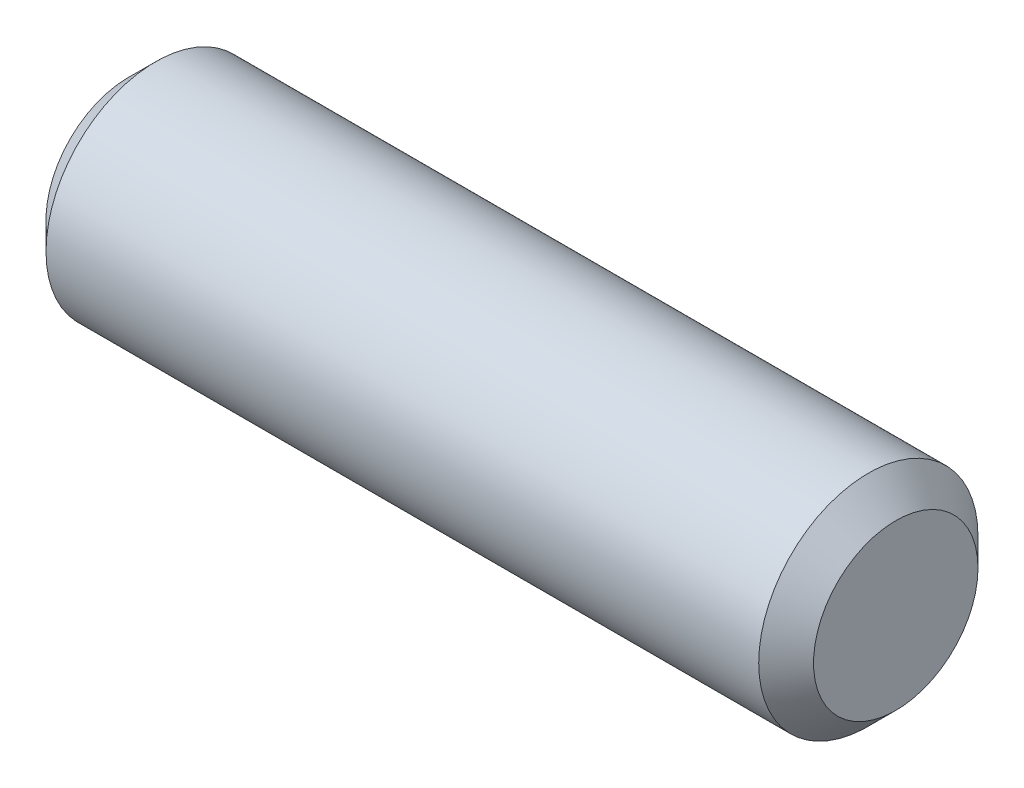
ISO-10303-21;
HEADER;
FILE_DESCRIPTION(('STEP AP214'),'2;1');
FILE_NAME('part.step','',(''),(''),'','','');
FILE_SCHEMA(('AUTOMOTIVE_DESIGN { 1 0 10303 214 1 1 1 1 }'));
ENDSEC;
DATA;
#1=APPLICATION_CONTEXT('core data for automotive mechanical design processes');
#2=APPLICATION_PROTOCOL_DEFINITION('international standard','automotive_design',2000,#1);
#3=PRODUCT_CONTEXT('',#1,'mechanical');
#4=PRODUCT('Part','Part','',(#3));
#5=PRODUCT_RELATED_PRODUCT_CATEGORY('part','',(#4));
#6=PRODUCT_DEFINITION_FORMATION('','',#4);
#7=PRODUCT_DEFINITION_CONTEXT('part definition',#1,'design');
#8=PRODUCT_DEFINITION('design','',#6,#7);
#9=PRODUCT_DEFINITION_SHAPE('','',#8);
#10=(LENGTH_UNIT() NAMED_UNIT(*) SI_UNIT(.MILLI.,.METRE.));
#11=(NAMED_UNIT(*) PLANE_ANGLE_UNIT() SI_UNIT($,.RADIAN.));
#12=(NAMED_UNIT(*) SI_UNIT($,.STERADIAN.) SOLID_ANGLE_UNIT());
#13=UNCERTAINTY_MEASURE_WITH_UNIT(LENGTH_MEASURE(1.E-05),#10,'distance_accuracy_value','');
#14=(GEOMETRIC_REPRESENTATION_CONTEXT(3) GLOBAL_UNCERTAINTY_ASSIGNED_CONTEXT((#13)) GLOBAL_UNIT_ASSIGNED_CONTEXT((#10,
#11,#12)) REPRESENTATION_CONTEXT('',''));
#15=CARTESIAN_POINT('',(0.,0.,0.));
#16=DIRECTION('',(0.,0.,1.));
#17=DIRECTION('',(1.,0.,0.));
#18=AXIS2_PLACEMENT_3D('',#15,#16,#17);
#19=CARTESIAN_POINT('',(14.,0.,0.));
#20=DIRECTION('',(-1.,0.,0.));
#21=DIRECTION('',(0.,0.,1.));
#22=AXIS2_PLACEMENT_3D('',#19,#20,#21);
#23=CYLINDRICAL_SURFACE('',#22,2.);
#24=CARTESIAN_POINT('',(13.5,0.,0.));
#25=DIRECTION('',(1.,0.,0.));
#26=DIRECTION('',(0.,0.,-1.));
#27=AXIS2_PLACEMENT_3D('',#24,#25,#26);
#28=CIRCLE('',#27,2.);
#29=CARTESIAN_POINT('',(13.5,0.,-2.));
#30=VERTEX_POINT('',#29);
#31=EDGE_CURVE('E39',#30,#30,#28,.F.);
#32=ORIENTED_EDGE('',*,*,#31,.T.);
#33=EDGE_LOOP('',(#32));
#34=FACE_BOUND('',#33,.T.);
#35=CARTESIAN_POINT('',(0.5,0.,0.));
#36=DIRECTION('',(1.,0.,0.));
#37=DIRECTION('',(0.,0.,-1.));
#38=AXIS2_PLACEMENT_3D('',#35,#36,#37);
#39=CIRCLE('',#38,2.);
#40=CARTESIAN_POINT('',(0.5,0.,-2.));
#41=VERTEX_POINT('',#40);
#42=EDGE_CURVE('E43',#41,#41,#39,.T.);
#43=ORIENTED_EDGE('',*,*,#42,.T.);
#44=EDGE_LOOP('',(#43));
#45=FACE_BOUND('',#44,.T.);
#46=ADVANCED_FACE('F32',(#34,#45),#23,.T.);
#47=CARTESIAN_POINT('',(14.,0.,0.));
#48=DIRECTION('',(1.,0.,0.));
#49=DIRECTION('',(0.,0.,-1.));
#50=AXIS2_PLACEMENT_3D('',#47,#48,#49);
#51=PLANE('',#50);
#52=CARTESIAN_POINT('',(14.,0.,0.));
#53=DIRECTION('',(1.,0.,0.));
#54=DIRECTION('',(0.,0.,-1.));
#55=AXIS2_PLACEMENT_3D('',#52,#53,#54);
#56=CIRCLE('',#55,1.5);
#57=CARTESIAN_POINT('',(14.,0.,-1.5));
#58=VERTEX_POINT('',#57);
#59=EDGE_CURVE('E47',#58,#58,#56,.T.);
#60=ORIENTED_EDGE('',*,*,#59,.T.);
#61=EDGE_LOOP('',(#60));
#62=FACE_BOUND('',#61,.T.);
#63=ADVANCED_FACE('F53',(#62),#51,.T.);
#64=CARTESIAN_POINT('',(0.,0.,0.));
#65=DIRECTION('',(1.,0.,0.));
#66=DIRECTION('',(0.,0.,-1.));
#67=AXIS2_PLACEMENT_3D('',#64,#65,#66);
#68=PLANE('',#67);
#69=CARTESIAN_POINT('',(0.,0.,0.));
#70=DIRECTION('',(1.,0.,0.));
#71=DIRECTION('',(0.,0.,-1.));
#72=AXIS2_PLACEMENT_3D('',#69,#70,#71);
#73=CIRCLE('',#72,1.5);
#74=CARTESIAN_POINT('',(0.,0.,-1.5));
#75=VERTEX_POINT('',#74);
#76=EDGE_CURVE('E10',#75,#75,#73,.F.);
#77=ORIENTED_EDGE('',*,*,#76,.T.);
#78=EDGE_LOOP('',(#77));
#79=FACE_BOUND('',#78,.T.);
#80=ADVANCED_FACE('F57',(#79),#68,.F.);
#81=CARTESIAN_POINT('',(14.,0.,0.));
#82=DIRECTION('',(-1.,0.,0.));
#83=DIRECTION('',(0.,0.,1.));
#84=AXIS2_PLACEMENT_3D('',#81,#82,#83);
#85=CONICAL_SURFACE('',#84,1.5,0.785398163397445);
#86=ORIENTED_EDGE('',*,*,#31,.F.);
#87=EDGE_LOOP('',(#86));
#88=FACE_BOUND('',#87,.T.);
#89=ORIENTED_EDGE('',*,*,#59,.F.);
#90=EDGE_LOOP('',(#89));
#91=FACE_BOUND('',#90,.T.);
#92=ADVANCED_FACE('F55',(#88,#91),#85,.T.);
#93=CARTESIAN_POINT('',(0.5,0.,0.));
#94=DIRECTION('',(1.,0.,0.));
#95=DIRECTION('',(0.,0.,-1.));
#96=AXIS2_PLACEMENT_3D('',#93,#94,#95);
#97=CONICAL_SURFACE('',#96,2.,0.78539816339745);
#98=ORIENTED_EDGE('',*,*,#76,.F.);
#99=EDGE_LOOP('',(#98));
#100=FACE_BOUND('',#99,.T.);
#101=ORIENTED_EDGE('',*,*,#42,.F.);
#102=EDGE_LOOP('',(#101));
#103=FACE_BOUND('',#102,.T.);
#104=ADVANCED_FACE('F34',(#100,#103),#97,.T.);
#105=CLOSED_SHELL('',(#46,#63,#80,#92,#104));
#106=MANIFOLD_SOLID_BREP('B2',#105);
#107=ADVANCED_BREP_SHAPE_REPRESENTATION('',(#18,#106),#14);
#108=SHAPE_DEFINITION_REPRESENTATION(#9,#107);
ENDSEC;
END-ISO-10303-21;
